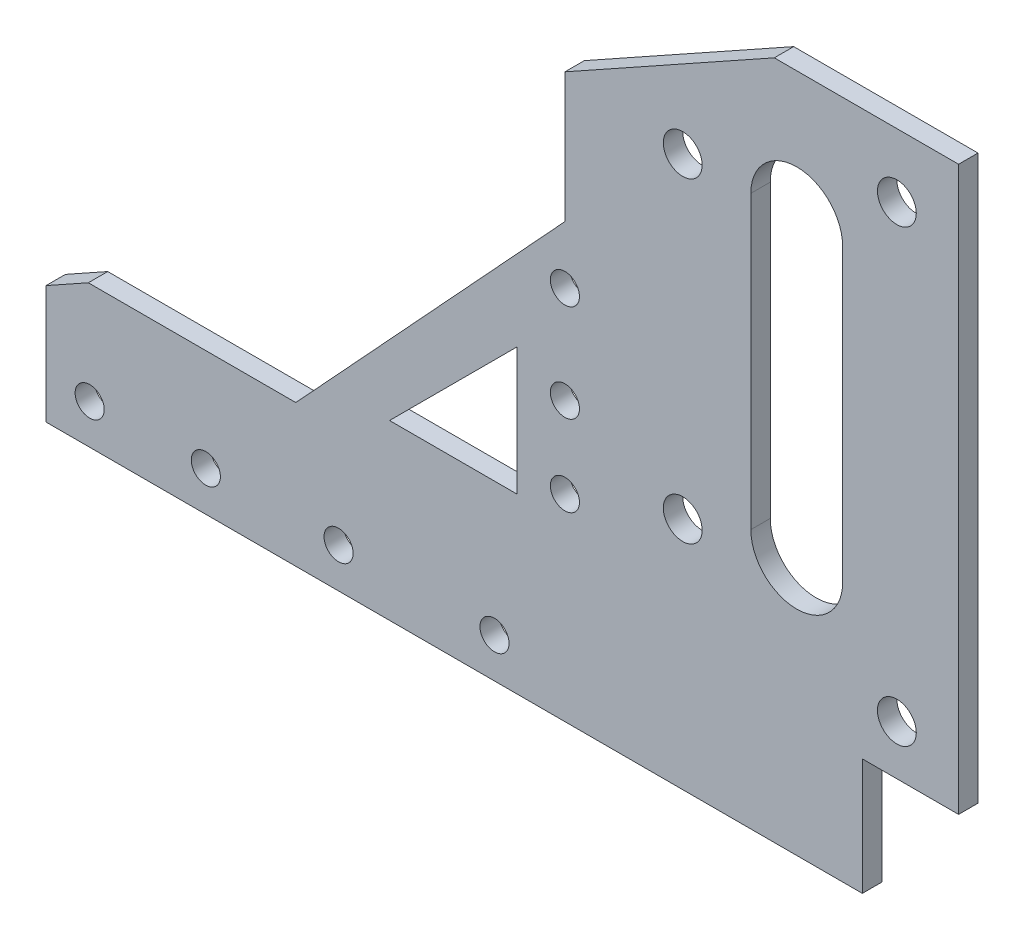
ISO-10303-21;
HEADER;
FILE_DESCRIPTION(('STEP AP214'),'2;1');
FILE_NAME('part.step','',(''),(''),'','','');
FILE_SCHEMA(('AUTOMOTIVE_DESIGN { 1 0 10303 214 1 1 1 1 }'));
ENDSEC;
DATA;
#1=APPLICATION_CONTEXT('core data for automotive mechanical design processes');
#2=APPLICATION_PROTOCOL_DEFINITION('international standard','automotive_design',2000,#1);
#3=PRODUCT_CONTEXT('',#1,'mechanical');
#4=PRODUCT('Part','Part','',(#3));
#5=PRODUCT_RELATED_PRODUCT_CATEGORY('part','',(#4));
#6=PRODUCT_DEFINITION_FORMATION('','',#4);
#7=PRODUCT_DEFINITION_CONTEXT('part definition',#1,'design');
#8=PRODUCT_DEFINITION('design','',#6,#7);
#9=PRODUCT_DEFINITION_SHAPE('','',#8);
#10=(LENGTH_UNIT() NAMED_UNIT(*) SI_UNIT(.MILLI.,.METRE.));
#11=(NAMED_UNIT(*) PLANE_ANGLE_UNIT() SI_UNIT($,.RADIAN.));
#12=(NAMED_UNIT(*) SI_UNIT($,.STERADIAN.) SOLID_ANGLE_UNIT());
#13=UNCERTAINTY_MEASURE_WITH_UNIT(LENGTH_MEASURE(1.E-05),#10,'distance_accuracy_value','');
#14=(GEOMETRIC_REPRESENTATION_CONTEXT(3) GLOBAL_UNCERTAINTY_ASSIGNED_CONTEXT((#13)) GLOBAL_UNIT_ASSIGNED_CONTEXT((#10,
#11,#12)) REPRESENTATION_CONTEXT('',''));
#15=CARTESIAN_POINT('',(0.,0.,0.));
#16=DIRECTION('',(0.,0.,1.));
#17=DIRECTION('',(1.,0.,0.));
#18=AXIS2_PLACEMENT_3D('',#15,#16,#17);
#19=CARTESIAN_POINT('',(0.,0.,10.));
#20=DIRECTION('',(0.,0.,1.));
#21=DIRECTION('',(1.,0.,0.));
#22=AXIS2_PLACEMENT_3D('',#19,#20,#21);
#23=PLANE('',#22);
#24=CARTESIAN_POINT('',(340.159565258512,67.6675286841399,10.));
#25=DIRECTION('',(0.,0.,1.));
#26=DIRECTION('',(1.,0.,0.));
#27=AXIS2_PLACEMENT_3D('',#24,#25,#26);
#28=CIRCLE('',#27,10.);
#29=CARTESIAN_POINT('',(350.159565258512,67.6675286841399,10.));
#30=VERTEX_POINT('',#29);
#31=EDGE_CURVE('E705',#30,#30,#28,.T.);
#32=ORIENTED_EDGE('',*,*,#31,.F.);
#33=EDGE_LOOP('',(#32));
#34=FACE_BOUND('',#33,.T.);
#35=CARTESIAN_POINT('',(229.870255563172,102.825256228943,10.));
#36=DIRECTION('',(0.,0.,1.));
#37=DIRECTION('',(1.,0.,0.));
#38=AXIS2_PLACEMENT_3D('',#35,#36,#37);
#39=CIRCLE('',#38,10.);
#40=CARTESIAN_POINT('',(239.870255563172,102.825256228943,10.));
#41=VERTEX_POINT('',#40);
#42=EDGE_CURVE('E721',#41,#41,#39,.T.);
#43=ORIENTED_EDGE('',*,*,#42,.F.);
#44=EDGE_LOOP('',(#43));
#45=FACE_BOUND('',#44,.T.);
#46=CARTESIAN_POINT('',(169.18705459543,125.357526881721,10.));
#47=DIRECTION('',(0.,0.,1.));
#48=DIRECTION('',(1.,0.,0.));
#49=AXIS2_PLACEMENT_3D('',#46,#47,#48);
#50=CIRCLE('',#49,7.50000000000001);
#51=CARTESIAN_POINT('',(176.68705459543,125.357526881721,10.));
#52=VERTEX_POINT('',#51);
#53=EDGE_CURVE('E737',#52,#52,#50,.T.);
#54=ORIENTED_EDGE('',*,*,#53,.F.);
#55=EDGE_LOOP('',(#54));
#56=FACE_BOUND('',#55,.T.);
#57=CARTESIAN_POINT('',(132.925934877688,2.64981336155931,10.));
#58=DIRECTION('',(0.,0.,1.));
#59=DIRECTION('',(1.,0.,0.));
#60=AXIS2_PLACEMENT_3D('',#57,#58,#59);
#61=CIRCLE('',#60,7.50000000000001);
#62=CARTESIAN_POINT('',(140.425934877688,2.64981336155931,10.));
#63=VERTEX_POINT('',#62);
#64=EDGE_CURVE('E753',#63,#63,#61,.T.);
#65=ORIENTED_EDGE('',*,*,#64,.F.);
#66=EDGE_LOOP('',(#65));
#67=FACE_BOUND('',#66,.T.);
#68=CARTESIAN_POINT('',(-75.5568013985008,2.64981336155931,10.));
#69=DIRECTION('',(0.,0.,1.));
#70=DIRECTION('',(1.,0.,0.));
#71=AXIS2_PLACEMENT_3D('',#68,#69,#70);
#72=CIRCLE('',#71,7.50000000000001);
#73=CARTESIAN_POINT('',(-68.0568013985008,2.64981336155931,10.));
#74=VERTEX_POINT('',#73);
#75=EDGE_CURVE('E769',#74,#74,#72,.T.);
#76=ORIENTED_EDGE('',*,*,#75,.F.);
#77=EDGE_LOOP('',(#76));
#78=FACE_BOUND('',#77,.T.);
#79=DIRECTION('',(0.,-1.,0.));
#80=VECTOR('',#79,1.);
#81=CARTESIAN_POINT('',(264.957256952062,265.671146953405,10.));
#82=LINE('',#81,#80);
#83=CARTESIAN_POINT('',(264.957256952062,265.671146953405,10.));
#84=VERTEX_POINT('',#83);
#85=CARTESIAN_POINT('',(264.957256952062,115.671146953405,10.));
#86=VERTEX_POINT('',#85);
#87=EDGE_CURVE('E174',#84,#86,#82,.T.);
#88=ORIENTED_EDGE('',*,*,#87,.F.);
#89=CARTESIAN_POINT('',(288.591642628585,265.671146953405,10.));
#90=DIRECTION('',(0.,0.,1.));
#91=DIRECTION('',(1.,0.,0.));
#92=AXIS2_PLACEMENT_3D('',#89,#90,#91);
#93=CIRCLE('',#92,23.6343856765227);
#94=CARTESIAN_POINT('',(312.226028305107,265.671146953405,10.));
#95=VERTEX_POINT('',#94);
#96=EDGE_CURVE('E165',#95,#84,#93,.T.);
#97=ORIENTED_EDGE('',*,*,#96,.F.);
#98=DIRECTION('',(0.,1.,0.));
#99=VECTOR('',#98,1.);
#100=CARTESIAN_POINT('',(312.226028305107,265.671146953405,10.));
#101=LINE('',#100,#99);
#102=CARTESIAN_POINT('',(312.226028305107,115.671146953405,10.));
#103=VERTEX_POINT('',#102);
#104=EDGE_CURVE('E192',#103,#95,#101,.T.);
#105=ORIENTED_EDGE('',*,*,#104,.F.);
#106=CARTESIAN_POINT('',(288.591642628585,115.671146953405,10.));
#107=DIRECTION('',(0.,0.,1.));
#108=DIRECTION('',(1.,0.,0.));
#109=AXIS2_PLACEMENT_3D('',#106,#107,#108);
#110=CIRCLE('',#109,23.6343856765226);
#111=EDGE_CURVE('E188',#86,#103,#110,.T.);
#112=ORIENTED_EDGE('',*,*,#111,.F.);
#113=EDGE_LOOP('',(#88,#97,#105,#112));
#114=FACE_BOUND('',#113,.T.);
#115=DIRECTION('',(0.,1.,0.));
#116=VECTOR('',#115,1.);
#117=CARTESIAN_POINT('',(144.620819019055,137.052411023087,10.));
#118=LINE('',#117,#116);
#119=CARTESIAN_POINT('',(144.620819019055,71.3064839125969,10.));
#120=VERTEX_POINT('',#119);
#121=CARTESIAN_POINT('',(144.620819019055,137.052411023087,10.));
#122=VERTEX_POINT('',#121);
#123=EDGE_CURVE('E219',#120,#122,#118,.T.);
#124=ORIENTED_EDGE('',*,*,#123,.F.);
#125=DIRECTION('',(1.,0.,0.));
#126=VECTOR('',#125,1.);
#127=CARTESIAN_POINT('',(144.620819019055,71.3064839125969,10.));
#128=LINE('',#127,#126);
#129=CARTESIAN_POINT('',(78.8748919085645,71.3064839125969,10.));
#130=VERTEX_POINT('',#129);
#131=EDGE_CURVE('E216',#130,#120,#128,.T.);
#132=ORIENTED_EDGE('',*,*,#131,.F.);
#133=DIRECTION('',(-0.707106781186548,-0.707106781186547,0.));
#134=VECTOR('',#133,1.);
#135=CARTESIAN_POINT('',(78.8748919085645,71.3064839125969,10.));
#136=LINE('',#135,#134);
#137=EDGE_CURVE('E224',#122,#130,#136,.T.);
#138=ORIENTED_EDGE('',*,*,#137,.F.);
#139=EDGE_LOOP('',(#124,#132,#138));
#140=FACE_BOUND('',#139,.T.);
#141=DIRECTION('',(-1.,0.,0.));
#142=VECTOR('',#141,1.);
#143=CARTESIAN_POINT('',(277.025034274635,332.140681003584,10.));
#144=LINE('',#143,#142);
#145=CARTESIAN_POINT('',(371.944880090182,332.140681003584,10.));
#146=VERTEX_POINT('',#145);
#147=CARTESIAN_POINT('',(277.025034274635,332.140681003584,10.));
#148=VERTEX_POINT('',#147);
#149=EDGE_CURVE('E249',#146,#148,#144,.T.);
#150=ORIENTED_EDGE('',*,*,#149,.T.);
#151=DIRECTION('',(-0.873276995123402,-0.48722406528028,0.));
#152=VECTOR('',#151,1.);
#153=CARTESIAN_POINT('',(277.025034274635,332.140681003584,10.));
#154=LINE('',#153,#152);
#155=CARTESIAN_POINT('',(169.18705459543,271.975052979122,10.));
#156=VERTEX_POINT('',#155);
#157=EDGE_CURVE('E253',#148,#156,#154,.T.);
#158=ORIENTED_EDGE('',*,*,#157,.T.);
#159=DIRECTION('',(0.,-1.,0.));
#160=VECTOR('',#159,1.);
#161=CARTESIAN_POINT('',(169.18705459543,271.975052979122,10.));
#162=LINE('',#161,#160);
#163=CARTESIAN_POINT('',(169.18705459543,205.170044113593,10.));
#164=VERTEX_POINT('',#163);
#165=EDGE_CURVE('E257',#156,#164,#162,.T.);
#166=ORIENTED_EDGE('',*,*,#165,.T.);
#167=DIRECTION('',(-0.678645627400867,-0.734465868784713,0.));
#168=VECTOR('',#167,1.);
#169=CARTESIAN_POINT('',(169.18705459543,205.170044113593,10.));
#170=LINE('',#169,#168);
#171=CARTESIAN_POINT('',(30.5872252002688,55.1700441135926,10.));
#172=VERTEX_POINT('',#171);
#173=EDGE_CURVE('E260',#164,#172,#170,.T.);
#174=ORIENTED_EDGE('',*,*,#173,.T.);
#175=DIRECTION('',(-1.,0.,0.));
#176=VECTOR('',#175,1.);
#177=CARTESIAN_POINT('',(30.5872252002688,55.1700441135926,10.));
#178=LINE('',#177,#176);
#179=CARTESIAN_POINT('',(-76.2685886222312,55.1700441135925,10.));
#180=VERTEX_POINT('',#179);
#181=EDGE_CURVE('E263',#172,#180,#178,.T.);
#182=ORIENTED_EDGE('',*,*,#181,.T.);
#183=DIRECTION('',(-0.873276995123402,-0.487224065280279,0.));
#184=VECTOR('',#183,1.);
#185=CARTESIAN_POINT('',(-76.2685886222312,55.1700441135925,10.));
#186=LINE('',#185,#184);
#187=CARTESIAN_POINT('',(-98.0551199098185,43.0147687524292,10.));
#188=VERTEX_POINT('',#187);
#189=EDGE_CURVE('E266',#180,#188,#186,.T.);
#190=ORIENTED_EDGE('',*,*,#189,.T.);
#191=DIRECTION('',(0.,-1.,0.));
#192=VECTOR('',#191,1.);
#193=CARTESIAN_POINT('',(-98.0551199098185,43.0147687524292,10.));
#194=LINE('',#193,#192);
#195=CARTESIAN_POINT('',(-98.0551199098185,-17.8593189964158,10.));
#196=VERTEX_POINT('',#195);
#197=EDGE_CURVE('E269',#188,#196,#194,.T.);
#198=ORIENTED_EDGE('',*,*,#197,.T.);
#199=DIRECTION('',(1.,0.,0.));
#200=VECTOR('',#199,1.);
#201=CARTESIAN_POINT('',(-98.0551199098185,-17.8593189964158,10.));
#202=LINE('',#201,#200);
#203=CARTESIAN_POINT('',(322.382476836474,-17.8593189964158,10.));
#204=VERTEX_POINT('',#203);
#205=EDGE_CURVE('E272',#196,#204,#202,.T.);
#206=ORIENTED_EDGE('',*,*,#205,.T.);
#207=DIRECTION('',(0.,1.,0.));
#208=VECTOR('',#207,1.);
#209=CARTESIAN_POINT('',(322.382476836474,-17.8593189964158,10.));
#210=LINE('',#209,#208);
#211=CARTESIAN_POINT('',(322.382476836474,42.1406810035843,10.));
#212=VERTEX_POINT('',#211);
#213=EDGE_CURVE('E275',#204,#212,#210,.T.);
#214=ORIENTED_EDGE('',*,*,#213,.T.);
#215=DIRECTION('',(1.,0.,0.));
#216=VECTOR('',#215,1.);
#217=CARTESIAN_POINT('',(322.382476836474,42.1406810035843,10.));
#218=LINE('',#217,#216);
#219=CARTESIAN_POINT('',(371.944880090182,42.1406810035843,10.));
#220=VERTEX_POINT('',#219);
#221=EDGE_CURVE('E278',#212,#220,#218,.T.);
#222=ORIENTED_EDGE('',*,*,#221,.T.);
#223=DIRECTION('',(0.,1.,0.));
#224=VECTOR('',#223,1.);
#225=CARTESIAN_POINT('',(371.944880090182,42.1406810035843,10.));
#226=LINE('',#225,#224);
#227=EDGE_CURVE('E281',#220,#146,#226,.T.);
#228=ORIENTED_EDGE('',*,*,#227,.T.);
#229=EDGE_LOOP('',(#150,#158,#166,#174,#182,#190,#198,#206,#214,#222,#228));
#230=FACE_BOUND('',#229,.T.);
#231=CARTESIAN_POINT('',(-15.7522245443548,2.64981336155931,10.));
#232=DIRECTION('',(0.,0.,1.));
#233=DIRECTION('',(1.,0.,0.));
#234=AXIS2_PLACEMENT_3D('',#231,#232,#233);
#235=CIRCLE('',#234,7.5);
#236=CARTESIAN_POINT('',(-8.25222454435485,2.64981336155931,10.));
#237=VERTEX_POINT('',#236);
#238=EDGE_CURVE('E200',#237,#237,#235,.T.);
#239=ORIENTED_EDGE('',*,*,#238,.F.);
#240=EDGE_LOOP('',(#239));
#241=FACE_BOUND('',#240,.T.);
#242=CARTESIAN_POINT('',(52.6367797208781,2.64981336155931,10.));
#243=DIRECTION('',(0.,0.,1.));
#244=DIRECTION('',(1.,0.,0.));
#245=AXIS2_PLACEMENT_3D('',#242,#243,#244);
#246=CIRCLE('',#245,7.5);
#247=CARTESIAN_POINT('',(60.1367797208781,2.64981336155931,10.));
#248=VERTEX_POINT('',#247);
#249=EDGE_CURVE('E761',#248,#248,#246,.T.);
#250=ORIENTED_EDGE('',*,*,#249,.F.);
#251=EDGE_LOOP('',(#250));
#252=FACE_BOUND('',#251,.T.);
#253=CARTESIAN_POINT('',(169.18705459543,83.6639784946238,10.));
#254=DIRECTION('',(0.,0.,1.));
#255=DIRECTION('',(1.,0.,0.));
#256=AXIS2_PLACEMENT_3D('',#253,#254,#255);
#257=CIRCLE('',#256,7.50000000000001);
#258=CARTESIAN_POINT('',(176.68705459543,83.6639784946238,10.));
#259=VERTEX_POINT('',#258);
#260=EDGE_CURVE('E745',#259,#259,#257,.T.);
#261=ORIENTED_EDGE('',*,*,#260,.F.);
#262=EDGE_LOOP('',(#261));
#263=FACE_BOUND('',#262,.T.);
#264=CARTESIAN_POINT('',(169.18705459543,175.474014336918,10.));
#265=DIRECTION('',(0.,0.,1.));
#266=DIRECTION('',(1.,0.,0.));
#267=AXIS2_PLACEMENT_3D('',#264,#265,#266);
#268=CIRCLE('',#267,7.50000000000001);
#269=CARTESIAN_POINT('',(176.68705459543,175.474014336918,10.));
#270=VERTEX_POINT('',#269);
#271=EDGE_CURVE('E729',#270,#270,#268,.T.);
#272=ORIENTED_EDGE('',*,*,#271,.F.);
#273=EDGE_LOOP('',(#272));
#274=FACE_BOUND('',#273,.T.);
#275=CARTESIAN_POINT('',(340.159565258512,299.323240314964,10.));
#276=DIRECTION('',(0.,0.,1.));
#277=DIRECTION('',(1.,0.,0.));
#278=AXIS2_PLACEMENT_3D('',#275,#276,#277);
#279=CIRCLE('',#278,10.);
#280=CARTESIAN_POINT('',(350.159565258512,299.323240314964,10.));
#281=VERTEX_POINT('',#280);
#282=EDGE_CURVE('E713',#281,#281,#279,.T.);
#283=ORIENTED_EDGE('',*,*,#282,.F.);
#284=EDGE_LOOP('',(#283));
#285=FACE_BOUND('',#284,.T.);
#286=CARTESIAN_POINT('',(229.870255563172,265.671146953405,10.));
#287=DIRECTION('',(0.,0.,1.));
#288=DIRECTION('',(1.,0.,0.));
#289=AXIS2_PLACEMENT_3D('',#286,#287,#288);
#290=CIRCLE('',#289,10.);
#291=CARTESIAN_POINT('',(239.870255563172,265.671146953405,10.));
#292=VERTEX_POINT('',#291);
#293=EDGE_CURVE('E694',#292,#292,#290,.T.);
#294=ORIENTED_EDGE('',*,*,#293,.F.);
#295=EDGE_LOOP('',(#294));
#296=FACE_BOUND('',#295,.T.);
#297=ADVANCED_FACE('F39',(#34,#45,#56,#67,#78,#114,#140,#230,#241,#252,#263,#274,#285,#296),#23,.T.);
#298=CARTESIAN_POINT('',(0.,0.,0.));
#299=DIRECTION('',(0.,0.,1.));
#300=DIRECTION('',(1.,0.,0.));
#301=AXIS2_PLACEMENT_3D('',#298,#299,#300);
#302=PLANE('',#301);
#303=DIRECTION('',(1.,0.,0.));
#304=VECTOR('',#303,1.);
#305=CARTESIAN_POINT('',(144.620819019055,71.3064839125969,0.));
#306=LINE('',#305,#304);
#307=CARTESIAN_POINT('',(78.8748919085645,71.3064839125969,0.));
#308=VERTEX_POINT('',#307);
#309=CARTESIAN_POINT('',(144.620819019055,71.3064839125969,0.));
#310=VERTEX_POINT('',#309);
#311=EDGE_CURVE('E183',#308,#310,#306,.T.);
#312=ORIENTED_EDGE('',*,*,#311,.T.);
#313=DIRECTION('',(0.,1.,0.));
#314=VECTOR('',#313,1.);
#315=CARTESIAN_POINT('',(144.620819019055,137.052411023087,0.));
#316=LINE('',#315,#314);
#317=CARTESIAN_POINT('',(144.620819019055,137.052411023087,0.));
#318=VERTEX_POINT('',#317);
#319=EDGE_CURVE('E231',#310,#318,#316,.T.);
#320=ORIENTED_EDGE('',*,*,#319,.T.);
#321=DIRECTION('',(-0.707106781186548,-0.707106781186547,0.));
#322=VECTOR('',#321,1.);
#323=CARTESIAN_POINT('',(78.8748919085645,71.3064839125969,0.));
#324=LINE('',#323,#322);
#325=EDGE_CURVE('E220',#318,#308,#324,.T.);
#326=ORIENTED_EDGE('',*,*,#325,.T.);
#327=EDGE_LOOP('',(#312,#320,#326));
#328=FACE_BOUND('',#327,.T.);
#329=DIRECTION('',(-1.,0.,0.));
#330=VECTOR('',#329,1.);
#331=CARTESIAN_POINT('',(277.025034274635,332.140681003584,0.));
#332=LINE('',#331,#330);
#333=CARTESIAN_POINT('',(371.944880090182,332.140681003584,0.));
#334=VERTEX_POINT('',#333);
#335=CARTESIAN_POINT('',(277.025034274635,332.140681003584,0.));
#336=VERTEX_POINT('',#335);
#337=EDGE_CURVE('E248',#334,#336,#332,.T.);
#338=ORIENTED_EDGE('',*,*,#337,.F.);
#339=DIRECTION('',(0.,1.,0.));
#340=VECTOR('',#339,1.);
#341=CARTESIAN_POINT('',(371.944880090182,42.1406810035843,0.));
#342=LINE('',#341,#340);
#343=CARTESIAN_POINT('',(371.944880090182,42.1406810035843,0.));
#344=VERTEX_POINT('',#343);
#345=EDGE_CURVE('E254',#344,#334,#342,.T.);
#346=ORIENTED_EDGE('',*,*,#345,.F.);
#347=DIRECTION('',(1.,0.,0.));
#348=VECTOR('',#347,1.);
#349=CARTESIAN_POINT('',(322.382476836474,42.1406810035843,0.));
#350=LINE('',#349,#348);
#351=CARTESIAN_POINT('',(322.382476836474,42.1406810035843,0.));
#352=VERTEX_POINT('',#351);
#353=EDGE_CURVE('E312',#352,#344,#350,.T.);
#354=ORIENTED_EDGE('',*,*,#353,.F.);
#355=DIRECTION('',(0.,1.,0.));
#356=VECTOR('',#355,1.);
#357=CARTESIAN_POINT('',(322.382476836474,-17.8593189964158,0.));
#358=LINE('',#357,#356);
#359=CARTESIAN_POINT('',(322.382476836474,-17.8593189964158,0.));
#360=VERTEX_POINT('',#359);
#361=EDGE_CURVE('E309',#360,#352,#358,.T.);
#362=ORIENTED_EDGE('',*,*,#361,.F.);
#363=DIRECTION('',(1.,0.,0.));
#364=VECTOR('',#363,1.);
#365=CARTESIAN_POINT('',(-98.0551199098185,-17.8593189964158,0.));
#366=LINE('',#365,#364);
#367=CARTESIAN_POINT('',(-98.0551199098185,-17.8593189964158,0.));
#368=VERTEX_POINT('',#367);
#369=EDGE_CURVE('E306',#368,#360,#366,.T.);
#370=ORIENTED_EDGE('',*,*,#369,.F.);
#371=DIRECTION('',(0.,-1.,0.));
#372=VECTOR('',#371,1.);
#373=CARTESIAN_POINT('',(-98.0551199098185,43.0147687524292,0.));
#374=LINE('',#373,#372);
#375=CARTESIAN_POINT('',(-98.0551199098185,43.0147687524292,0.));
#376=VERTEX_POINT('',#375);
#377=EDGE_CURVE('E303',#376,#368,#374,.T.);
#378=ORIENTED_EDGE('',*,*,#377,.F.);
#379=DIRECTION('',(-0.873276995123402,-0.487224065280279,0.));
#380=VECTOR('',#379,1.);
#381=CARTESIAN_POINT('',(-76.2685886222312,55.1700441135925,0.));
#382=LINE('',#381,#380);
#383=CARTESIAN_POINT('',(-76.2685886222312,55.1700441135925,0.));
#384=VERTEX_POINT('',#383);
#385=EDGE_CURVE('E300',#384,#376,#382,.T.);
#386=ORIENTED_EDGE('',*,*,#385,.F.);
#387=DIRECTION('',(-1.,0.,0.));
#388=VECTOR('',#387,1.);
#389=CARTESIAN_POINT('',(30.5872252002688,55.1700441135926,0.));
#390=LINE('',#389,#388);
#391=CARTESIAN_POINT('',(30.5872252002688,55.1700441135926,0.));
#392=VERTEX_POINT('',#391);
#393=EDGE_CURVE('E297',#392,#384,#390,.T.);
#394=ORIENTED_EDGE('',*,*,#393,.F.);
#395=DIRECTION('',(-0.678645627400867,-0.734465868784713,0.));
#396=VECTOR('',#395,1.);
#397=CARTESIAN_POINT('',(169.18705459543,205.170044113593,0.));
#398=LINE('',#397,#396);
#399=CARTESIAN_POINT('',(169.18705459543,205.170044113593,0.));
#400=VERTEX_POINT('',#399);
#401=EDGE_CURVE('E294',#400,#392,#398,.T.);
#402=ORIENTED_EDGE('',*,*,#401,.F.);
#403=DIRECTION('',(0.,-1.,0.));
#404=VECTOR('',#403,1.);
#405=CARTESIAN_POINT('',(169.18705459543,271.975052979122,0.));
#406=LINE('',#405,#404);
#407=CARTESIAN_POINT('',(169.18705459543,271.975052979122,0.));
#408=VERTEX_POINT('',#407);
#409=EDGE_CURVE('E291',#408,#400,#406,.T.);
#410=ORIENTED_EDGE('',*,*,#409,.F.);
#411=DIRECTION('',(-0.873276995123402,-0.48722406528028,0.));
#412=VECTOR('',#411,1.);
#413=CARTESIAN_POINT('',(277.025034274635,332.140681003584,0.));
#414=LINE('',#413,#412);
#415=EDGE_CURVE('E288',#336,#408,#414,.T.);
#416=ORIENTED_EDGE('',*,*,#415,.F.);
#417=EDGE_LOOP('',(#338,#346,#354,#362,#370,#378,#386,#394,#402,#410,#416));
#418=FACE_BOUND('',#417,.T.);
#419=CARTESIAN_POINT('',(288.591642628585,265.671146953405,0.));
#420=DIRECTION('',(0.,0.,1.));
#421=DIRECTION('',(1.,0.,0.));
#422=AXIS2_PLACEMENT_3D('',#419,#420,#421);
#423=CIRCLE('',#422,23.6343856765227);
#424=CARTESIAN_POINT('',(312.226028305107,265.671146953405,0.));
#425=VERTEX_POINT('',#424);
#426=CARTESIAN_POINT('',(264.957256952062,265.671146953405,0.));
#427=VERTEX_POINT('',#426);
#428=EDGE_CURVE('E63',#425,#427,#423,.T.);
#429=ORIENTED_EDGE('',*,*,#428,.T.);
#430=DIRECTION('',(0.,-1.,0.));
#431=VECTOR('',#430,1.);
#432=CARTESIAN_POINT('',(264.957256952062,265.671146953405,0.));
#433=LINE('',#432,#431);
#434=CARTESIAN_POINT('',(264.957256952062,115.671146953405,0.));
#435=VERTEX_POINT('',#434);
#436=EDGE_CURVE('E181',#427,#435,#433,.T.);
#437=ORIENTED_EDGE('',*,*,#436,.T.);
#438=CARTESIAN_POINT('',(288.591642628585,115.671146953405,0.));
#439=DIRECTION('',(0.,0.,1.));
#440=DIRECTION('',(1.,0.,0.));
#441=AXIS2_PLACEMENT_3D('',#438,#439,#440);
#442=CIRCLE('',#441,23.6343856765226);
#443=CARTESIAN_POINT('',(312.226028305107,115.671146953405,0.));
#444=VERTEX_POINT('',#443);
#445=EDGE_CURVE('E203',#435,#444,#442,.T.);
#446=ORIENTED_EDGE('',*,*,#445,.T.);
#447=DIRECTION('',(0.,1.,0.));
#448=VECTOR('',#447,1.);
#449=CARTESIAN_POINT('',(312.226028305107,265.671146953405,0.));
#450=LINE('',#449,#448);
#451=EDGE_CURVE('E175',#444,#425,#450,.T.);
#452=ORIENTED_EDGE('',*,*,#451,.T.);
#453=EDGE_LOOP('',(#429,#437,#446,#452));
#454=FACE_BOUND('',#453,.T.);
#455=CARTESIAN_POINT('',(-15.7522245443548,2.64981336155931,0.));
#456=DIRECTION('',(0.,0.,1.));
#457=DIRECTION('',(1.,0.,0.));
#458=AXIS2_PLACEMENT_3D('',#455,#456,#457);
#459=CIRCLE('',#458,7.5);
#460=CARTESIAN_POINT('',(-8.25222454435485,2.64981336155931,0.));
#461=VERTEX_POINT('',#460);
#462=EDGE_CURVE('E773',#461,#461,#459,.T.);
#463=ORIENTED_EDGE('',*,*,#462,.T.);
#464=EDGE_LOOP('',(#463));
#465=FACE_BOUND('',#464,.T.);
#466=CARTESIAN_POINT('',(-75.5568013985008,2.64981336155931,0.));
#467=DIRECTION('',(0.,0.,1.));
#468=DIRECTION('',(1.,0.,0.));
#469=AXIS2_PLACEMENT_3D('',#466,#467,#468);
#470=CIRCLE('',#469,7.50000000000001);
#471=CARTESIAN_POINT('',(-68.0568013985008,2.64981336155931,0.));
#472=VERTEX_POINT('',#471);
#473=EDGE_CURVE('E765',#472,#472,#470,.T.);
#474=ORIENTED_EDGE('',*,*,#473,.T.);
#475=EDGE_LOOP('',(#474));
#476=FACE_BOUND('',#475,.T.);
#477=CARTESIAN_POINT('',(52.6367797208781,2.64981336155931,0.));
#478=DIRECTION('',(0.,0.,1.));
#479=DIRECTION('',(1.,0.,0.));
#480=AXIS2_PLACEMENT_3D('',#477,#478,#479);
#481=CIRCLE('',#480,7.5);
#482=CARTESIAN_POINT('',(60.1367797208781,2.64981336155931,0.));
#483=VERTEX_POINT('',#482);
#484=EDGE_CURVE('E757',#483,#483,#481,.T.);
#485=ORIENTED_EDGE('',*,*,#484,.T.);
#486=EDGE_LOOP('',(#485));
#487=FACE_BOUND('',#486,.T.);
#488=CARTESIAN_POINT('',(132.925934877688,2.64981336155931,0.));
#489=DIRECTION('',(0.,0.,1.));
#490=DIRECTION('',(1.,0.,0.));
#491=AXIS2_PLACEMENT_3D('',#488,#489,#490);
#492=CIRCLE('',#491,7.50000000000001);
#493=CARTESIAN_POINT('',(140.425934877688,2.64981336155931,0.));
#494=VERTEX_POINT('',#493);
#495=EDGE_CURVE('E749',#494,#494,#492,.T.);
#496=ORIENTED_EDGE('',*,*,#495,.T.);
#497=EDGE_LOOP('',(#496));
#498=FACE_BOUND('',#497,.T.);
#499=CARTESIAN_POINT('',(169.18705459543,83.6639784946238,0.));
#500=DIRECTION('',(0.,0.,1.));
#501=DIRECTION('',(1.,0.,0.));
#502=AXIS2_PLACEMENT_3D('',#499,#500,#501);
#503=CIRCLE('',#502,7.50000000000001);
#504=CARTESIAN_POINT('',(176.68705459543,83.6639784946238,0.));
#505=VERTEX_POINT('',#504);
#506=EDGE_CURVE('E741',#505,#505,#503,.T.);
#507=ORIENTED_EDGE('',*,*,#506,.T.);
#508=EDGE_LOOP('',(#507));
#509=FACE_BOUND('',#508,.T.);
#510=CARTESIAN_POINT('',(169.18705459543,125.357526881721,0.));
#511=DIRECTION('',(0.,0.,1.));
#512=DIRECTION('',(1.,0.,0.));
#513=AXIS2_PLACEMENT_3D('',#510,#511,#512);
#514=CIRCLE('',#513,7.50000000000001);
#515=CARTESIAN_POINT('',(176.68705459543,125.357526881721,0.));
#516=VERTEX_POINT('',#515);
#517=EDGE_CURVE('E733',#516,#516,#514,.T.);
#518=ORIENTED_EDGE('',*,*,#517,.T.);
#519=EDGE_LOOP('',(#518));
#520=FACE_BOUND('',#519,.T.);
#521=CARTESIAN_POINT('',(169.18705459543,175.474014336918,0.));
#522=DIRECTION('',(0.,0.,1.));
#523=DIRECTION('',(1.,0.,0.));
#524=AXIS2_PLACEMENT_3D('',#521,#522,#523);
#525=CIRCLE('',#524,7.50000000000001);
#526=CARTESIAN_POINT('',(176.68705459543,175.474014336918,0.));
#527=VERTEX_POINT('',#526);
#528=EDGE_CURVE('E725',#527,#527,#525,.T.);
#529=ORIENTED_EDGE('',*,*,#528,.T.);
#530=EDGE_LOOP('',(#529));
#531=FACE_BOUND('',#530,.T.);
#532=CARTESIAN_POINT('',(229.870255563172,102.825256228943,0.));
#533=DIRECTION('',(0.,0.,1.));
#534=DIRECTION('',(1.,0.,0.));
#535=AXIS2_PLACEMENT_3D('',#532,#533,#534);
#536=CIRCLE('',#535,10.);
#537=CARTESIAN_POINT('',(239.870255563172,102.825256228943,0.));
#538=VERTEX_POINT('',#537);
#539=EDGE_CURVE('E717',#538,#538,#536,.T.);
#540=ORIENTED_EDGE('',*,*,#539,.T.);
#541=EDGE_LOOP('',(#540));
#542=FACE_BOUND('',#541,.T.);
#543=CARTESIAN_POINT('',(340.159565258512,299.323240314964,0.));
#544=DIRECTION('',(0.,0.,1.));
#545=DIRECTION('',(1.,0.,0.));
#546=AXIS2_PLACEMENT_3D('',#543,#544,#545);
#547=CIRCLE('',#546,10.);
#548=CARTESIAN_POINT('',(350.159565258512,299.323240314964,0.));
#549=VERTEX_POINT('',#548);
#550=EDGE_CURVE('E709',#549,#549,#547,.T.);
#551=ORIENTED_EDGE('',*,*,#550,.T.);
#552=EDGE_LOOP('',(#551));
#553=FACE_BOUND('',#552,.T.);
#554=CARTESIAN_POINT('',(340.159565258512,67.6675286841399,0.));
#555=DIRECTION('',(0.,0.,1.));
#556=DIRECTION('',(1.,0.,0.));
#557=AXIS2_PLACEMENT_3D('',#554,#555,#556);
#558=CIRCLE('',#557,10.);
#559=CARTESIAN_POINT('',(350.159565258512,67.6675286841399,0.));
#560=VERTEX_POINT('',#559);
#561=EDGE_CURVE('E702',#560,#560,#558,.T.);
#562=ORIENTED_EDGE('',*,*,#561,.T.);
#563=EDGE_LOOP('',(#562));
#564=FACE_BOUND('',#563,.T.);
#565=CARTESIAN_POINT('',(229.870255563172,265.671146953405,0.));
#566=DIRECTION('',(0.,0.,1.));
#567=DIRECTION('',(1.,0.,0.));
#568=AXIS2_PLACEMENT_3D('',#565,#566,#567);
#569=CIRCLE('',#568,10.);
#570=CARTESIAN_POINT('',(239.870255563172,265.671146953405,0.));
#571=VERTEX_POINT('',#570);
#572=EDGE_CURVE('E697',#571,#571,#569,.T.);
#573=ORIENTED_EDGE('',*,*,#572,.T.);
#574=EDGE_LOOP('',(#573));
#575=FACE_BOUND('',#574,.T.);
#576=ADVANCED_FACE('F363',(#328,#418,#454,#465,#476,#487,#498,#509,#520,#531,#542,#553,#564,
#575),#302,.F.);
#577=CARTESIAN_POINT('',(277.025034274635,332.140681003584,10.));
#578=DIRECTION('',(0.,-1.,0.));
#579=DIRECTION('',(0.,0.,-1.));
#580=AXIS2_PLACEMENT_3D('',#577,#578,#579);
#581=PLANE('',#580);
#582=ORIENTED_EDGE('',*,*,#337,.T.);
#583=DIRECTION('',(0.,0.,-1.));
#584=VECTOR('',#583,1.);
#585=CARTESIAN_POINT('',(277.025034274635,332.140681003584,10.));
#586=LINE('',#585,#584);
#587=EDGE_CURVE('E11',#148,#336,#586,.T.);
#588=ORIENTED_EDGE('',*,*,#587,.F.);
#589=ORIENTED_EDGE('',*,*,#149,.F.);
#590=DIRECTION('',(0.,0.,-1.));
#591=VECTOR('',#590,1.);
#592=CARTESIAN_POINT('',(371.944880090182,332.140681003584,10.));
#593=LINE('',#592,#591);
#594=EDGE_CURVE('E284',#146,#334,#593,.T.);
#595=ORIENTED_EDGE('',*,*,#594,.T.);
#596=EDGE_LOOP('',(#582,#588,#589,#595));
#597=FACE_BOUND('',#596,.T.);
#598=ADVANCED_FACE('F41',(#597),#581,.F.);
#599=CARTESIAN_POINT('',(277.025034274635,332.140681003584,10.));
#600=DIRECTION('',(0.48722406528028,-0.873276995123402,0.));
#601=DIRECTION('',(0.873276995123402,0.48722406528028,0.));
#602=AXIS2_PLACEMENT_3D('',#599,#600,#601);
#603=PLANE('',#602);
#604=ORIENTED_EDGE('',*,*,#415,.T.);
#605=DIRECTION('',(0.,0.,-1.));
#606=VECTOR('',#605,1.);
#607=CARTESIAN_POINT('',(169.18705459543,271.975052979122,10.));
#608=LINE('',#607,#606);
#609=EDGE_CURVE('E48',#156,#408,#608,.T.);
#610=ORIENTED_EDGE('',*,*,#609,.F.);
#611=ORIENTED_EDGE('',*,*,#157,.F.);
#612=ORIENTED_EDGE('',*,*,#587,.T.);
#613=EDGE_LOOP('',(#604,#610,#611,#612));
#614=FACE_BOUND('',#613,.T.);
#615=ADVANCED_FACE('F381',(#614),#603,.F.);
#616=CARTESIAN_POINT('',(169.18705459543,271.975052979122,10.));
#617=DIRECTION('',(1.,0.,0.));
#618=DIRECTION('',(0.,1.,0.));
#619=AXIS2_PLACEMENT_3D('',#616,#617,#618);
#620=PLANE('',#619);
#621=ORIENTED_EDGE('',*,*,#409,.T.);
#622=DIRECTION('',(0.,0.,-1.));
#623=VECTOR('',#622,1.);
#624=CARTESIAN_POINT('',(169.18705459543,205.170044113593,10.));
#625=LINE('',#624,#623);
#626=EDGE_CURVE('E348',#164,#400,#625,.T.);
#627=ORIENTED_EDGE('',*,*,#626,.F.);
#628=ORIENTED_EDGE('',*,*,#165,.F.);
#629=ORIENTED_EDGE('',*,*,#609,.T.);
#630=EDGE_LOOP('',(#621,#627,#628,#629));
#631=FACE_BOUND('',#630,.T.);
#632=ADVANCED_FACE('F357',(#631),#620,.F.);
#633=CARTESIAN_POINT('',(169.18705459543,205.170044113593,10.));
#634=DIRECTION('',(0.734465868784713,-0.678645627400867,0.));
#635=DIRECTION('',(0.678645627400867,0.734465868784713,0.));
#636=AXIS2_PLACEMENT_3D('',#633,#634,#635);
#637=PLANE('',#636);
#638=ORIENTED_EDGE('',*,*,#401,.T.);
#639=DIRECTION('',(0.,0.,-1.));
#640=VECTOR('',#639,1.);
#641=CARTESIAN_POINT('',(30.5872252002688,55.1700441135926,10.));
#642=LINE('',#641,#640);
#643=EDGE_CURVE('E344',#172,#392,#642,.T.);
#644=ORIENTED_EDGE('',*,*,#643,.F.);
#645=ORIENTED_EDGE('',*,*,#173,.F.);
#646=ORIENTED_EDGE('',*,*,#626,.T.);
#647=EDGE_LOOP('',(#638,#644,#645,#646));
#648=FACE_BOUND('',#647,.T.);
#649=ADVANCED_FACE('F369',(#648),#637,.F.);
#650=CARTESIAN_POINT('',(30.5872252002688,55.1700441135926,10.));
#651=DIRECTION('',(0.,-1.,0.));
#652=DIRECTION('',(1.,0.,0.));
#653=AXIS2_PLACEMENT_3D('',#650,#651,#652);
#654=PLANE('',#653);
#655=ORIENTED_EDGE('',*,*,#393,.T.);
#656=DIRECTION('',(0.,0.,-1.));
#657=VECTOR('',#656,1.);
#658=CARTESIAN_POINT('',(-76.2685886222312,55.1700441135925,10.));
#659=LINE('',#658,#657);
#660=EDGE_CURVE('E340',#180,#384,#659,.T.);
#661=ORIENTED_EDGE('',*,*,#660,.F.);
#662=ORIENTED_EDGE('',*,*,#181,.F.);
#663=ORIENTED_EDGE('',*,*,#643,.T.);
#664=EDGE_LOOP('',(#655,#661,#662,#663));
#665=FACE_BOUND('',#664,.T.);
#666=ADVANCED_FACE('F373',(#665),#654,.F.);
#667=CARTESIAN_POINT('',(-76.2685886222312,55.1700441135925,10.));
#668=DIRECTION('',(0.487224065280279,-0.873276995123402,0.));
#669=DIRECTION('',(0.873276995123402,0.487224065280279,0.));
#670=AXIS2_PLACEMENT_3D('',#667,#668,#669);
#671=PLANE('',#670);
#672=ORIENTED_EDGE('',*,*,#385,.T.);
#673=DIRECTION('',(0.,0.,-1.));
#674=VECTOR('',#673,1.);
#675=CARTESIAN_POINT('',(-98.0551199098185,43.0147687524292,10.));
#676=LINE('',#675,#674);
#677=EDGE_CURVE('E336',#188,#376,#676,.T.);
#678=ORIENTED_EDGE('',*,*,#677,.F.);
#679=ORIENTED_EDGE('',*,*,#189,.F.);
#680=ORIENTED_EDGE('',*,*,#660,.T.);
#681=EDGE_LOOP('',(#672,#678,#679,#680));
#682=FACE_BOUND('',#681,.T.);
#683=ADVANCED_FACE('F409',(#682),#671,.F.);
#684=CARTESIAN_POINT('',(-98.0551199098185,43.0147687524292,10.));
#685=DIRECTION('',(1.,0.,0.));
#686=DIRECTION('',(0.,0.,-1.));
#687=AXIS2_PLACEMENT_3D('',#684,#685,#686);
#688=PLANE('',#687);
#689=ORIENTED_EDGE('',*,*,#377,.T.);
#690=DIRECTION('',(0.,0.,-1.));
#691=VECTOR('',#690,1.);
#692=CARTESIAN_POINT('',(-98.0551199098185,-17.8593189964158,10.));
#693=LINE('',#692,#691);
#694=EDGE_CURVE('E332',#196,#368,#693,.T.);
#695=ORIENTED_EDGE('',*,*,#694,.F.);
#696=ORIENTED_EDGE('',*,*,#197,.F.);
#697=ORIENTED_EDGE('',*,*,#677,.T.);
#698=EDGE_LOOP('',(#689,#695,#696,#697));
#699=FACE_BOUND('',#698,.T.);
#700=ADVANCED_FACE('F407',(#699),#688,.F.);
#701=CARTESIAN_POINT('',(-98.0551199098185,-17.8593189964158,10.));
#702=DIRECTION('',(0.,1.,0.));
#703=DIRECTION('',(0.,0.,1.));
#704=AXIS2_PLACEMENT_3D('',#701,#702,#703);
#705=PLANE('',#704);
#706=ORIENTED_EDGE('',*,*,#369,.T.);
#707=DIRECTION('',(0.,0.,-1.));
#708=VECTOR('',#707,1.);
#709=CARTESIAN_POINT('',(322.382476836474,-17.8593189964158,10.));
#710=LINE('',#709,#708);
#711=EDGE_CURVE('E328',#204,#360,#710,.T.);
#712=ORIENTED_EDGE('',*,*,#711,.F.);
#713=ORIENTED_EDGE('',*,*,#205,.F.);
#714=ORIENTED_EDGE('',*,*,#694,.T.);
#715=EDGE_LOOP('',(#706,#712,#713,#714));
#716=FACE_BOUND('',#715,.T.);
#717=ADVANCED_FACE('F402',(#716),#705,.F.);
#718=CARTESIAN_POINT('',(322.382476836474,-17.8593189964158,10.));
#719=DIRECTION('',(-1.,0.,0.));
#720=DIRECTION('',(0.,0.,1.));
#721=AXIS2_PLACEMENT_3D('',#718,#719,#720);
#722=PLANE('',#721);
#723=ORIENTED_EDGE('',*,*,#361,.T.);
#724=DIRECTION('',(0.,0.,-1.));
#725=VECTOR('',#724,1.);
#726=CARTESIAN_POINT('',(322.382476836474,42.1406810035843,10.));
#727=LINE('',#726,#725);
#728=EDGE_CURVE('E324',#212,#352,#727,.T.);
#729=ORIENTED_EDGE('',*,*,#728,.F.);
#730=ORIENTED_EDGE('',*,*,#213,.F.);
#731=ORIENTED_EDGE('',*,*,#711,.T.);
#732=EDGE_LOOP('',(#723,#729,#730,#731));
#733=FACE_BOUND('',#732,.T.);
#734=ADVANCED_FACE('F397',(#733),#722,.F.);
#735=CARTESIAN_POINT('',(322.382476836474,42.1406810035843,10.));
#736=DIRECTION('',(0.,1.,0.));
#737=DIRECTION('',(0.,0.,1.));
#738=AXIS2_PLACEMENT_3D('',#735,#736,#737);
#739=PLANE('',#738);
#740=ORIENTED_EDGE('',*,*,#353,.T.);
#741=DIRECTION('',(0.,0.,-1.));
#742=VECTOR('',#741,1.);
#743=CARTESIAN_POINT('',(371.944880090182,42.1406810035843,10.));
#744=LINE('',#743,#742);
#745=EDGE_CURVE('E320',#220,#344,#744,.T.);
#746=ORIENTED_EDGE('',*,*,#745,.F.);
#747=ORIENTED_EDGE('',*,*,#221,.F.);
#748=ORIENTED_EDGE('',*,*,#728,.T.);
#749=EDGE_LOOP('',(#740,#746,#747,#748));
#750=FACE_BOUND('',#749,.T.);
#751=ADVANCED_FACE('F393',(#750),#739,.F.);
#752=CARTESIAN_POINT('',(371.944880090182,42.1406810035843,10.));
#753=DIRECTION('',(-1.,0.,0.));
#754=DIRECTION('',(0.,0.,1.));
#755=AXIS2_PLACEMENT_3D('',#752,#753,#754);
#756=PLANE('',#755);
#757=ORIENTED_EDGE('',*,*,#345,.T.);
#758=ORIENTED_EDGE('',*,*,#594,.F.);
#759=ORIENTED_EDGE('',*,*,#227,.F.);
#760=ORIENTED_EDGE('',*,*,#745,.T.);
#761=EDGE_LOOP('',(#757,#758,#759,#760));
#762=FACE_BOUND('',#761,.T.);
#763=ADVANCED_FACE('F388',(#762),#756,.F.);
#764=CARTESIAN_POINT('',(144.620819019055,71.3064839125969,10.));
#765=DIRECTION('',(0.,1.,0.));
#766=DIRECTION('',(0.,0.,1.));
#767=AXIS2_PLACEMENT_3D('',#764,#765,#766);
#768=PLANE('',#767);
#769=ORIENTED_EDGE('',*,*,#311,.F.);
#770=DIRECTION('',(0.,0.,-1.));
#771=VECTOR('',#770,1.);
#772=CARTESIAN_POINT('',(78.8748919085645,71.3064839125969,10.));
#773=LINE('',#772,#771);
#774=EDGE_CURVE('E227',#130,#308,#773,.T.);
#775=ORIENTED_EDGE('',*,*,#774,.F.);
#776=ORIENTED_EDGE('',*,*,#131,.T.);
#777=DIRECTION('',(0.,0.,-1.));
#778=VECTOR('',#777,1.);
#779=CARTESIAN_POINT('',(144.620819019055,71.3064839125969,10.));
#780=LINE('',#779,#778);
#781=EDGE_CURVE('E244',#120,#310,#780,.T.);
#782=ORIENTED_EDGE('',*,*,#781,.T.);
#783=EDGE_LOOP('',(#769,#775,#776,#782));
#784=FACE_BOUND('',#783,.T.);
#785=ADVANCED_FACE('F429',(#784),#768,.T.);
#786=CARTESIAN_POINT('',(144.620819019055,137.052411023087,10.));
#787=DIRECTION('',(-1.,0.,0.));
#788=DIRECTION('',(0.,-1.,0.));
#789=AXIS2_PLACEMENT_3D('',#786,#787,#788);
#790=PLANE('',#789);
#791=ORIENTED_EDGE('',*,*,#319,.F.);
#792=ORIENTED_EDGE('',*,*,#781,.F.);
#793=ORIENTED_EDGE('',*,*,#123,.T.);
#794=DIRECTION('',(0.,0.,-1.));
#795=VECTOR('',#794,1.);
#796=CARTESIAN_POINT('',(144.620819019055,137.052411023087,10.));
#797=LINE('',#796,#795);
#798=EDGE_CURVE('E241',#122,#318,#797,.T.);
#799=ORIENTED_EDGE('',*,*,#798,.T.);
#800=EDGE_LOOP('',(#791,#792,#793,#799));
#801=FACE_BOUND('',#800,.T.);
#802=ADVANCED_FACE('F461',(#801),#790,.T.);
#803=CARTESIAN_POINT('',(78.8748919085645,71.3064839125969,10.));
#804=DIRECTION('',(0.707106781186547,-0.707106781186548,0.));
#805=DIRECTION('',(0.707106781186548,0.707106781186547,0.));
#806=AXIS2_PLACEMENT_3D('',#803,#804,#805);
#807=PLANE('',#806);
#808=ORIENTED_EDGE('',*,*,#325,.F.);
#809=ORIENTED_EDGE('',*,*,#798,.F.);
#810=ORIENTED_EDGE('',*,*,#137,.T.);
#811=ORIENTED_EDGE('',*,*,#774,.T.);
#812=EDGE_LOOP('',(#808,#809,#810,#811));
#813=FACE_BOUND('',#812,.T.);
#814=ADVANCED_FACE('F468',(#813),#807,.T.);
#815=CARTESIAN_POINT('',(288.591642628585,265.671146953405,10.));
#816=DIRECTION('',(0.,0.,-1.));
#817=DIRECTION('',(-1.,0.,0.));
#818=AXIS2_PLACEMENT_3D('',#815,#816,#817);
#819=CYLINDRICAL_SURFACE('',#818,23.6343856765227);
#820=ORIENTED_EDGE('',*,*,#428,.F.);
#821=DIRECTION('',(0.,0.,-1.));
#822=VECTOR('',#821,1.);
#823=CARTESIAN_POINT('',(312.226028305107,265.671146953405,10.));
#824=LINE('',#823,#822);
#825=EDGE_CURVE('E169',#95,#425,#824,.T.);
#826=ORIENTED_EDGE('',*,*,#825,.F.);
#827=ORIENTED_EDGE('',*,*,#96,.T.);
#828=DIRECTION('',(0.,0.,-1.));
#829=VECTOR('',#828,1.);
#830=CARTESIAN_POINT('',(264.957256952062,265.671146953405,10.));
#831=LINE('',#830,#829);
#832=EDGE_CURVE('E168',#84,#427,#831,.T.);
#833=ORIENTED_EDGE('',*,*,#832,.T.);
#834=EDGE_LOOP('',(#820,#826,#827,#833));
#835=FACE_BOUND('',#834,.T.);
#836=ADVANCED_FACE('F167',(#835),#819,.F.);
#837=CARTESIAN_POINT('',(264.957256952062,265.671146953405,10.));
#838=DIRECTION('',(1.,0.,0.));
#839=DIRECTION('',(0.,1.,0.));
#840=AXIS2_PLACEMENT_3D('',#837,#838,#839);
#841=PLANE('',#840);
#842=ORIENTED_EDGE('',*,*,#436,.F.);
#843=ORIENTED_EDGE('',*,*,#832,.F.);
#844=ORIENTED_EDGE('',*,*,#87,.T.);
#845=DIRECTION('',(0.,0.,-1.));
#846=VECTOR('',#845,1.);
#847=CARTESIAN_POINT('',(264.957256952062,115.671146953405,10.));
#848=LINE('',#847,#846);
#849=EDGE_CURVE('E184',#86,#435,#848,.T.);
#850=ORIENTED_EDGE('',*,*,#849,.T.);
#851=EDGE_LOOP('',(#842,#843,#844,#850));
#852=FACE_BOUND('',#851,.T.);
#853=ADVANCED_FACE('F178',(#852),#841,.T.);
#854=CARTESIAN_POINT('',(288.591642628585,115.671146953405,10.));
#855=DIRECTION('',(0.,0.,-1.));
#856=DIRECTION('',(-1.,0.,0.));
#857=AXIS2_PLACEMENT_3D('',#854,#855,#856);
#858=CYLINDRICAL_SURFACE('',#857,23.6343856765226);
#859=ORIENTED_EDGE('',*,*,#445,.F.);
#860=ORIENTED_EDGE('',*,*,#849,.F.);
#861=ORIENTED_EDGE('',*,*,#111,.T.);
#862=DIRECTION('',(0.,0.,-1.));
#863=VECTOR('',#862,1.);
#864=CARTESIAN_POINT('',(312.226028305107,115.671146953405,10.));
#865=LINE('',#864,#863);
#866=EDGE_CURVE('E55',#103,#444,#865,.T.);
#867=ORIENTED_EDGE('',*,*,#866,.T.);
#868=EDGE_LOOP('',(#859,#860,#861,#867));
#869=FACE_BOUND('',#868,.T.);
#870=ADVANCED_FACE('F488',(#869),#858,.F.);
#871=CARTESIAN_POINT('',(312.226028305107,265.671146953405,10.));
#872=DIRECTION('',(-1.,0.,0.));
#873=DIRECTION('',(0.,0.,1.));
#874=AXIS2_PLACEMENT_3D('',#871,#872,#873);
#875=PLANE('',#874);
#876=ORIENTED_EDGE('',*,*,#451,.F.);
#877=ORIENTED_EDGE('',*,*,#866,.F.);
#878=ORIENTED_EDGE('',*,*,#104,.T.);
#879=ORIENTED_EDGE('',*,*,#825,.T.);
#880=EDGE_LOOP('',(#876,#877,#878,#879));
#881=FACE_BOUND('',#880,.T.);
#882=ADVANCED_FACE('F495',(#881),#875,.T.);
#883=CARTESIAN_POINT('',(-15.7522245443548,2.64981336155931,10.));
#884=DIRECTION('',(0.,0.,-1.));
#885=DIRECTION('',(-1.,0.,0.));
#886=AXIS2_PLACEMENT_3D('',#883,#884,#885);
#887=CYLINDRICAL_SURFACE('',#886,7.5);
#888=ORIENTED_EDGE('',*,*,#238,.T.);
#889=EDGE_LOOP('',(#888));
#890=FACE_BOUND('',#889,.T.);
#891=ORIENTED_EDGE('',*,*,#462,.F.);
#892=EDGE_LOOP('',(#891));
#893=FACE_BOUND('',#892,.T.);
#894=ADVANCED_FACE('F503',(#890,#893),#887,.F.);
#895=CARTESIAN_POINT('',(-75.5568013985008,2.64981336155931,10.));
#896=DIRECTION('',(0.,0.,-1.));
#897=DIRECTION('',(-1.,0.,0.));
#898=AXIS2_PLACEMENT_3D('',#895,#896,#897);
#899=CYLINDRICAL_SURFACE('',#898,7.50000000000001);
#900=ORIENTED_EDGE('',*,*,#75,.T.);
#901=EDGE_LOOP('',(#900));
#902=FACE_BOUND('',#901,.T.);
#903=ORIENTED_EDGE('',*,*,#473,.F.);
#904=EDGE_LOOP('',(#903));
#905=FACE_BOUND('',#904,.T.);
#906=ADVANCED_FACE('F510',(#902,#905),#899,.F.);
#907=CARTESIAN_POINT('',(52.6367797208781,2.64981336155931,10.));
#908=DIRECTION('',(0.,0.,-1.));
#909=DIRECTION('',(-1.,0.,0.));
#910=AXIS2_PLACEMENT_3D('',#907,#908,#909);
#911=CYLINDRICAL_SURFACE('',#910,7.5);
#912=ORIENTED_EDGE('',*,*,#249,.T.);
#913=EDGE_LOOP('',(#912));
#914=FACE_BOUND('',#913,.T.);
#915=ORIENTED_EDGE('',*,*,#484,.F.);
#916=EDGE_LOOP('',(#915));
#917=FACE_BOUND('',#916,.T.);
#918=ADVANCED_FACE('F518',(#914,#917),#911,.F.);
#919=CARTESIAN_POINT('',(132.925934877688,2.64981336155931,10.));
#920=DIRECTION('',(0.,0.,-1.));
#921=DIRECTION('',(-1.,0.,0.));
#922=AXIS2_PLACEMENT_3D('',#919,#920,#921);
#923=CYLINDRICAL_SURFACE('',#922,7.50000000000001);
#924=ORIENTED_EDGE('',*,*,#64,.T.);
#925=EDGE_LOOP('',(#924));
#926=FACE_BOUND('',#925,.T.);
#927=ORIENTED_EDGE('',*,*,#495,.F.);
#928=EDGE_LOOP('',(#927));
#929=FACE_BOUND('',#928,.T.);
#930=ADVANCED_FACE('F526',(#926,#929),#923,.F.);
#931=CARTESIAN_POINT('',(169.18705459543,83.6639784946238,10.));
#932=DIRECTION('',(0.,0.,-1.));
#933=DIRECTION('',(-1.,0.,0.));
#934=AXIS2_PLACEMENT_3D('',#931,#932,#933);
#935=CYLINDRICAL_SURFACE('',#934,7.50000000000001);
#936=ORIENTED_EDGE('',*,*,#260,.T.);
#937=EDGE_LOOP('',(#936));
#938=FACE_BOUND('',#937,.T.);
#939=ORIENTED_EDGE('',*,*,#506,.F.);
#940=EDGE_LOOP('',(#939));
#941=FACE_BOUND('',#940,.T.);
#942=ADVANCED_FACE('F534',(#938,#941),#935,.F.);
#943=CARTESIAN_POINT('',(169.18705459543,125.357526881721,10.));
#944=DIRECTION('',(0.,0.,-1.));
#945=DIRECTION('',(-1.,0.,0.));
#946=AXIS2_PLACEMENT_3D('',#943,#944,#945);
#947=CYLINDRICAL_SURFACE('',#946,7.50000000000001);
#948=ORIENTED_EDGE('',*,*,#53,.T.);
#949=EDGE_LOOP('',(#948));
#950=FACE_BOUND('',#949,.T.);
#951=ORIENTED_EDGE('',*,*,#517,.F.);
#952=EDGE_LOOP('',(#951));
#953=FACE_BOUND('',#952,.T.);
#954=ADVANCED_FACE('F542',(#950,#953),#947,.F.);
#955=CARTESIAN_POINT('',(169.18705459543,175.474014336918,10.));
#956=DIRECTION('',(0.,0.,-1.));
#957=DIRECTION('',(-1.,0.,0.));
#958=AXIS2_PLACEMENT_3D('',#955,#956,#957);
#959=CYLINDRICAL_SURFACE('',#958,7.50000000000001);
#960=ORIENTED_EDGE('',*,*,#271,.T.);
#961=EDGE_LOOP('',(#960));
#962=FACE_BOUND('',#961,.T.);
#963=ORIENTED_EDGE('',*,*,#528,.F.);
#964=EDGE_LOOP('',(#963));
#965=FACE_BOUND('',#964,.T.);
#966=ADVANCED_FACE('F550',(#962,#965),#959,.F.);
#967=CARTESIAN_POINT('',(229.870255563172,102.825256228943,10.));
#968=DIRECTION('',(0.,0.,-1.));
#969=DIRECTION('',(-1.,0.,0.));
#970=AXIS2_PLACEMENT_3D('',#967,#968,#969);
#971=CYLINDRICAL_SURFACE('',#970,10.);
#972=ORIENTED_EDGE('',*,*,#42,.T.);
#973=EDGE_LOOP('',(#972));
#974=FACE_BOUND('',#973,.T.);
#975=ORIENTED_EDGE('',*,*,#539,.F.);
#976=EDGE_LOOP('',(#975));
#977=FACE_BOUND('',#976,.T.);
#978=ADVANCED_FACE('F558',(#974,#977),#971,.F.);
#979=CARTESIAN_POINT('',(340.159565258512,299.323240314964,10.));
#980=DIRECTION('',(0.,0.,-1.));
#981=DIRECTION('',(-1.,0.,0.));
#982=AXIS2_PLACEMENT_3D('',#979,#980,#981);
#983=CYLINDRICAL_SURFACE('',#982,10.);
#984=ORIENTED_EDGE('',*,*,#282,.T.);
#985=EDGE_LOOP('',(#984));
#986=FACE_BOUND('',#985,.T.);
#987=ORIENTED_EDGE('',*,*,#550,.F.);
#988=EDGE_LOOP('',(#987));
#989=FACE_BOUND('',#988,.T.);
#990=ADVANCED_FACE('F566',(#986,#989),#983,.F.);
#991=CARTESIAN_POINT('',(340.159565258512,67.6675286841399,10.));
#992=DIRECTION('',(0.,0.,-1.));
#993=DIRECTION('',(-1.,0.,0.));
#994=AXIS2_PLACEMENT_3D('',#991,#992,#993);
#995=CYLINDRICAL_SURFACE('',#994,10.);
#996=ORIENTED_EDGE('',*,*,#31,.T.);
#997=EDGE_LOOP('',(#996));
#998=FACE_BOUND('',#997,.T.);
#999=ORIENTED_EDGE('',*,*,#561,.F.);
#1000=EDGE_LOOP('',(#999));
#1001=FACE_BOUND('',#1000,.T.);
#1002=ADVANCED_FACE('F574',(#998,#1001),#995,.F.);
#1003=CARTESIAN_POINT('',(229.870255563172,265.671146953405,10.));
#1004=DIRECTION('',(0.,0.,-1.));
#1005=DIRECTION('',(-1.,0.,0.));
#1006=AXIS2_PLACEMENT_3D('',#1003,#1004,#1005);
#1007=CYLINDRICAL_SURFACE('',#1006,10.);
#1008=ORIENTED_EDGE('',*,*,#293,.T.);
#1009=EDGE_LOOP('',(#1008));
#1010=FACE_BOUND('',#1009,.T.);
#1011=ORIENTED_EDGE('',*,*,#572,.F.);
#1012=EDGE_LOOP('',(#1011));
#1013=FACE_BOUND('',#1012,.T.);
#1014=ADVANCED_FACE('F582',(#1010,#1013),#1007,.F.);
#1015=CLOSED_SHELL('',(#297,#576,#598,#615,#632,#649,#666,#683,#700,#717,#734,#751,#763,#785,
#802,#814,#836,#853,#870,#882,#894,#906,#918,#930,#942,#954,#966,#978,#990,#1002,#1014));
#1016=MANIFOLD_SOLID_BREP('B2',#1015);
#1017=ADVANCED_BREP_SHAPE_REPRESENTATION('',(#18,#1016),#14);
#1018=SHAPE_DEFINITION_REPRESENTATION(#9,#1017);
ENDSEC;
END-ISO-10303-21;
